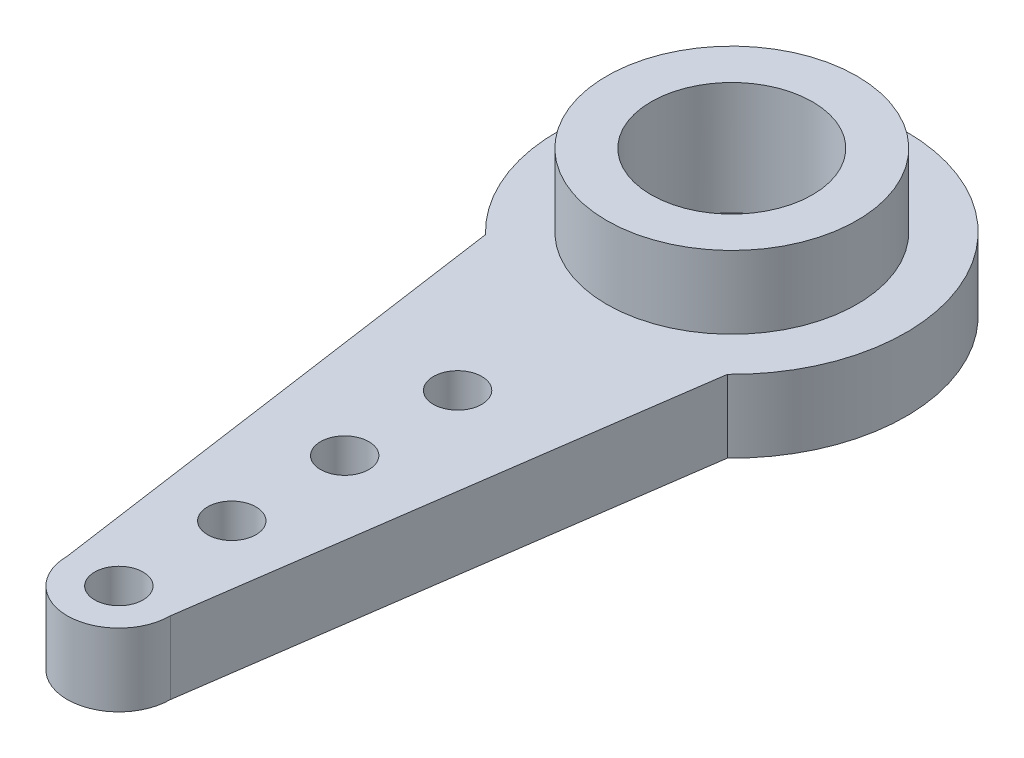
ISO-10303-21;
HEADER;
FILE_DESCRIPTION(('STEP AP214'),'2;1');
FILE_NAME('part.step','',(''),(''),'','','');
FILE_SCHEMA(('AUTOMOTIVE_DESIGN { 1 0 10303 214 1 1 1 1 }'));
ENDSEC;
DATA;
#1=APPLICATION_CONTEXT('core data for automotive mechanical design processes');
#2=APPLICATION_PROTOCOL_DEFINITION('international standard','automotive_design',2000,#1);
#3=PRODUCT_CONTEXT('',#1,'mechanical');
#4=PRODUCT('Part','Part','',(#3));
#5=PRODUCT_RELATED_PRODUCT_CATEGORY('part','',(#4));
#6=PRODUCT_DEFINITION_FORMATION('','',#4);
#7=PRODUCT_DEFINITION_CONTEXT('part definition',#1,'design');
#8=PRODUCT_DEFINITION('design','',#6,#7);
#9=PRODUCT_DEFINITION_SHAPE('','',#8);
#10=(LENGTH_UNIT() NAMED_UNIT(*) SI_UNIT(.MILLI.,.METRE.));
#11=(NAMED_UNIT(*) PLANE_ANGLE_UNIT() SI_UNIT($,.RADIAN.));
#12=(NAMED_UNIT(*) SI_UNIT($,.STERADIAN.) SOLID_ANGLE_UNIT());
#13=UNCERTAINTY_MEASURE_WITH_UNIT(LENGTH_MEASURE(1.E-05),#10,'distance_accuracy_value','');
#14=(GEOMETRIC_REPRESENTATION_CONTEXT(3) GLOBAL_UNCERTAINTY_ASSIGNED_CONTEXT((#13)) GLOBAL_UNIT_ASSIGNED_CONTEXT((#10,
#11,#12)) REPRESENTATION_CONTEXT('',''));
#15=CARTESIAN_POINT('',(0.,0.,0.));
#16=DIRECTION('',(0.,0.,1.));
#17=DIRECTION('',(1.,0.,0.));
#18=AXIS2_PLACEMENT_3D('',#15,#16,#17);
#19=CARTESIAN_POINT('',(0.,0.,0.));
#20=DIRECTION('',(0.,1.,0.));
#21=DIRECTION('',(0.,0.,1.));
#22=AXIS2_PLACEMENT_3D('',#19,#20,#21);
#23=PLANE('',#22);
#24=CARTESIAN_POINT('',(0.,0.,0.));
#25=DIRECTION('',(0.,-1.,0.));
#26=DIRECTION('',(0.,0.,-1.));
#27=AXIS2_PLACEMENT_3D('',#24,#25,#26);
#28=CIRCLE('',#27,2.00852796678638);
#29=CARTESIAN_POINT('',(0.,0.,-2.00852796678638));
#30=VERTEX_POINT('',#29);
#31=EDGE_CURVE('E167',#30,#30,#28,.T.);
#32=ORIENTED_EDGE('',*,*,#31,.F.);
#33=EDGE_LOOP('',(#32));
#34=FACE_BOUND('',#33,.T.);
#35=CARTESIAN_POINT('',(0.,0.,0.));
#36=DIRECTION('',(0.,-1.,0.));
#37=DIRECTION('',(0.,0.,-1.));
#38=AXIS2_PLACEMENT_3D('',#35,#36,#37);
#39=CIRCLE('',#38,3.);
#40=CARTESIAN_POINT('',(0.,0.,-3.));
#41=VERTEX_POINT('',#40);
#42=EDGE_CURVE('E170',#41,#41,#39,.T.);
#43=ORIENTED_EDGE('',*,*,#42,.T.);
#44=EDGE_LOOP('',(#43));
#45=FACE_BOUND('',#44,.T.);
#46=ADVANCED_FACE('F51',(#34,#45),#23,.F.);
#47=CARTESIAN_POINT('',(0.,2.25,0.));
#48=DIRECTION('',(0.,-1.,0.));
#49=DIRECTION('',(0.,0.,-1.));
#50=AXIS2_PLACEMENT_3D('',#47,#48,#49);
#51=CYLINDRICAL_SURFACE('',#50,2.5);
#52=CARTESIAN_POINT('',(0.,4.5,0.));
#53=DIRECTION('',(0.,1.,0.));
#54=DIRECTION('',(0.,0.,1.));
#55=AXIS2_PLACEMENT_3D('',#52,#53,#54);
#56=CIRCLE('',#55,2.5);
#57=CARTESIAN_POINT('',(0.,4.5,2.5));
#58=VERTEX_POINT('',#57);
#59=EDGE_CURVE('E182',#58,#58,#56,.T.);
#60=ORIENTED_EDGE('',*,*,#59,.T.);
#61=EDGE_LOOP('',(#60));
#62=FACE_BOUND('',#61,.T.);
#63=CARTESIAN_POINT('',(0.,1.,0.));
#64=DIRECTION('',(0.,-1.,0.));
#65=DIRECTION('',(0.,0.,-1.));
#66=AXIS2_PLACEMENT_3D('',#63,#64,#65);
#67=CIRCLE('',#66,2.5);
#68=CARTESIAN_POINT('',(0.,1.,-2.5));
#69=VERTEX_POINT('',#68);
#70=EDGE_CURVE('E177',#69,#69,#67,.T.);
#71=ORIENTED_EDGE('',*,*,#70,.T.);
#72=EDGE_LOOP('',(#71));
#73=FACE_BOUND('',#72,.T.);
#74=ADVANCED_FACE('F143',(#62,#73),#51,.F.);
#75=CARTESIAN_POINT('',(0.,2.25,0.));
#76=DIRECTION('',(0.,1.,0.));
#77=DIRECTION('',(0.,0.,1.));
#78=AXIS2_PLACEMENT_3D('',#75,#76,#77);
#79=PLANE('',#78);
#80=DIRECTION('',(0.140830303687937,0.,-0.990033749709152));
#81=VECTOR('',#80,1.);
#82=CARTESIAN_POINT('',(1.6,2.25,19.));
#83=LINE('',#82,#81);
#84=CARTESIAN_POINT('',(1.6,2.25,19.));
#85=VERTEX_POINT('',#84);
#86=CARTESIAN_POINT('',(3.75,2.25,3.88555015409659));
#87=VERTEX_POINT('',#86);
#88=EDGE_CURVE('E111',#85,#87,#83,.T.);
#89=ORIENTED_EDGE('',*,*,#88,.T.);
#90=CARTESIAN_POINT('',(0.,2.25,0.));
#91=DIRECTION('',(0.,1.,0.));
#92=DIRECTION('',(0.,0.,1.));
#93=AXIS2_PLACEMENT_3D('',#90,#91,#92);
#94=CIRCLE('',#93,5.4);
#95=CARTESIAN_POINT('',(-3.75,2.25,3.88555015409659));
#96=VERTEX_POINT('',#95);
#97=EDGE_CURVE('E68',#87,#96,#94,.T.);
#98=ORIENTED_EDGE('',*,*,#97,.T.);
#99=DIRECTION('',(0.140830303687938,0.,0.990033749709152));
#100=VECTOR('',#99,1.);
#101=CARTESIAN_POINT('',(-3.75,2.25,3.88555015409659));
#102=LINE('',#101,#100);
#103=CARTESIAN_POINT('',(-1.6,2.25,19.));
#104=VERTEX_POINT('',#103);
#105=EDGE_CURVE('E99',#96,#104,#102,.T.);
#106=ORIENTED_EDGE('',*,*,#105,.T.);
#107=CARTESIAN_POINT('',(0.,2.25,19.));
#108=DIRECTION('',(0.,1.,0.));
#109=DIRECTION('',(0.,0.,1.));
#110=AXIS2_PLACEMENT_3D('',#107,#108,#109);
#111=CIRCLE('',#110,1.6);
#112=EDGE_CURVE('E104',#104,#85,#111,.T.);
#113=ORIENTED_EDGE('',*,*,#112,.T.);
#114=EDGE_LOOP('',(#89,#98,#106,#113));
#115=FACE_BOUND('',#114,.T.);
#116=CARTESIAN_POINT('',(0.,2.25,8.5));
#117=DIRECTION('',(0.,1.,0.));
#118=DIRECTION('',(0.,0.,1.));
#119=AXIS2_PLACEMENT_3D('',#116,#117,#118);
#120=CIRCLE('',#119,0.75);
#121=CARTESIAN_POINT('',(0.,2.25,9.25));
#122=VERTEX_POINT('',#121);
#123=EDGE_CURVE('E192',#122,#122,#120,.T.);
#124=ORIENTED_EDGE('',*,*,#123,.F.);
#125=EDGE_LOOP('',(#124));
#126=FACE_BOUND('',#125,.T.);
#127=CARTESIAN_POINT('',(0.,2.25,15.5));
#128=DIRECTION('',(0.,1.,0.));
#129=DIRECTION('',(0.,0.,1.));
#130=AXIS2_PLACEMENT_3D('',#127,#128,#129);
#131=CIRCLE('',#130,0.750000000000001);
#132=CARTESIAN_POINT('',(0.,2.25,16.25));
#133=VERTEX_POINT('',#132);
#134=EDGE_CURVE('E204',#133,#133,#131,.T.);
#135=ORIENTED_EDGE('',*,*,#134,.F.);
#136=EDGE_LOOP('',(#135));
#137=FACE_BOUND('',#136,.T.);
#138=CARTESIAN_POINT('',(0.,2.25,19.));
#139=DIRECTION('',(0.,1.,0.));
#140=DIRECTION('',(0.,0.,1.));
#141=AXIS2_PLACEMENT_3D('',#138,#139,#140);
#142=CIRCLE('',#141,0.75);
#143=CARTESIAN_POINT('',(0.,2.25,19.75));
#144=VERTEX_POINT('',#143);
#145=EDGE_CURVE('E118',#144,#144,#142,.T.);
#146=ORIENTED_EDGE('',*,*,#145,.F.);
#147=EDGE_LOOP('',(#146));
#148=FACE_BOUND('',#147,.T.);
#149=CARTESIAN_POINT('',(0.,2.25,12.));
#150=DIRECTION('',(0.,1.,0.));
#151=DIRECTION('',(0.,0.,1.));
#152=AXIS2_PLACEMENT_3D('',#149,#150,#151);
#153=CIRCLE('',#152,0.750000000000001);
#154=CARTESIAN_POINT('',(0.,2.25,12.75));
#155=VERTEX_POINT('',#154);
#156=EDGE_CURVE('E198',#155,#155,#153,.T.);
#157=ORIENTED_EDGE('',*,*,#156,.F.);
#158=EDGE_LOOP('',(#157));
#159=FACE_BOUND('',#158,.T.);
#160=CARTESIAN_POINT('',(0.,2.25,0.));
#161=DIRECTION('',(0.,1.,0.));
#162=DIRECTION('',(0.,0.,1.));
#163=AXIS2_PLACEMENT_3D('',#160,#161,#162);
#164=CIRCLE('',#163,3.87950189537483);
#165=CARTESIAN_POINT('',(0.,2.25,3.87950189537483));
#166=VERTEX_POINT('',#165);
#167=EDGE_CURVE('E185',#166,#166,#164,.T.);
#168=ORIENTED_EDGE('',*,*,#167,.F.);
#169=EDGE_LOOP('',(#168));
#170=FACE_BOUND('',#169,.T.);
#171=ADVANCED_FACE('F101',(#115,#126,#137,#148,#159,#170),#79,.T.);
#172=CARTESIAN_POINT('',(0.,0.,0.));
#173=DIRECTION('',(0.,-1.,0.));
#174=DIRECTION('',(0.,0.,-1.));
#175=AXIS2_PLACEMENT_3D('',#172,#173,#174);
#176=CIRCLE('',#175,3.8);
#177=CARTESIAN_POINT('',(0.,0.,-3.8));
#178=VERTEX_POINT('',#177);
#179=EDGE_CURVE('E161',#178,#178,#176,.T.);
#180=ORIENTED_EDGE('',*,*,#179,.F.);
#181=EDGE_LOOP('',(#180));
#182=FACE_BOUND('',#181,.T.);
#183=DIRECTION('',(0.140830303687938,0.,0.990033749709152));
#184=VECTOR('',#183,1.);
#185=CARTESIAN_POINT('',(-3.75,0.,3.88555015409659));
#186=LINE('',#185,#184);
#187=CARTESIAN_POINT('',(-3.75,0.,3.88555015409659));
#188=VERTEX_POINT('',#187);
#189=CARTESIAN_POINT('',(-1.6,0.,19.));
#190=VERTEX_POINT('',#189);
#191=EDGE_CURVE('E107',#188,#190,#186,.T.);
#192=ORIENTED_EDGE('',*,*,#191,.F.);
#193=CARTESIAN_POINT('',(0.,0.,0.));
#194=DIRECTION('',(0.,1.,0.));
#195=DIRECTION('',(0.,0.,1.));
#196=AXIS2_PLACEMENT_3D('',#193,#194,#195);
#197=CIRCLE('',#196,5.4);
#198=CARTESIAN_POINT('',(3.75,0.,3.88555015409659));
#199=VERTEX_POINT('',#198);
#200=EDGE_CURVE('E121',#199,#188,#197,.T.);
#201=ORIENTED_EDGE('',*,*,#200,.F.);
#202=DIRECTION('',(0.140830303687937,0.,-0.990033749709152));
#203=VECTOR('',#202,1.);
#204=CARTESIAN_POINT('',(1.6,0.,19.));
#205=LINE('',#204,#203);
#206=CARTESIAN_POINT('',(1.6,0.,19.));
#207=VERTEX_POINT('',#206);
#208=EDGE_CURVE('E93',#207,#199,#205,.T.);
#209=ORIENTED_EDGE('',*,*,#208,.F.);
#210=CARTESIAN_POINT('',(0.,0.,19.));
#211=DIRECTION('',(0.,1.,0.));
#212=DIRECTION('',(0.,0.,1.));
#213=AXIS2_PLACEMENT_3D('',#210,#211,#212);
#214=CIRCLE('',#213,1.6);
#215=EDGE_CURVE('E86',#190,#207,#214,.T.);
#216=ORIENTED_EDGE('',*,*,#215,.F.);
#217=EDGE_LOOP('',(#192,#201,#209,#216));
#218=FACE_BOUND('',#217,.T.);
#219=CARTESIAN_POINT('',(0.,0.,19.));
#220=DIRECTION('',(0.,1.,0.));
#221=DIRECTION('',(0.,0.,1.));
#222=AXIS2_PLACEMENT_3D('',#219,#220,#221);
#223=CIRCLE('',#222,0.75);
#224=CARTESIAN_POINT('',(0.,0.,19.75));
#225=VERTEX_POINT('',#224);
#226=EDGE_CURVE('E207',#225,#225,#223,.T.);
#227=ORIENTED_EDGE('',*,*,#226,.T.);
#228=EDGE_LOOP('',(#227));
#229=FACE_BOUND('',#228,.T.);
#230=CARTESIAN_POINT('',(0.,0.,15.5));
#231=DIRECTION('',(0.,1.,0.));
#232=DIRECTION('',(0.,0.,1.));
#233=AXIS2_PLACEMENT_3D('',#230,#231,#232);
#234=CIRCLE('',#233,0.750000000000001);
#235=CARTESIAN_POINT('',(0.,0.,16.25));
#236=VERTEX_POINT('',#235);
#237=EDGE_CURVE('E201',#236,#236,#234,.T.);
#238=ORIENTED_EDGE('',*,*,#237,.T.);
#239=EDGE_LOOP('',(#238));
#240=FACE_BOUND('',#239,.T.);
#241=CARTESIAN_POINT('',(0.,0.,12.));
#242=DIRECTION('',(0.,1.,0.));
#243=DIRECTION('',(0.,0.,1.));
#244=AXIS2_PLACEMENT_3D('',#241,#242,#243);
#245=CIRCLE('',#244,0.750000000000001);
#246=CARTESIAN_POINT('',(0.,0.,12.75));
#247=VERTEX_POINT('',#246);
#248=EDGE_CURVE('E195',#247,#247,#245,.T.);
#249=ORIENTED_EDGE('',*,*,#248,.T.);
#250=EDGE_LOOP('',(#249));
#251=FACE_BOUND('',#250,.T.);
#252=CARTESIAN_POINT('',(0.,0.,8.5));
#253=DIRECTION('',(0.,1.,0.));
#254=DIRECTION('',(0.,0.,1.));
#255=AXIS2_PLACEMENT_3D('',#252,#253,#254);
#256=CIRCLE('',#255,0.75);
#257=CARTESIAN_POINT('',(0.,0.,9.25));
#258=VERTEX_POINT('',#257);
#259=EDGE_CURVE('E189',#258,#258,#256,.T.);
#260=ORIENTED_EDGE('',*,*,#259,.T.);
#261=EDGE_LOOP('',(#260));
#262=FACE_BOUND('',#261,.T.);
#263=ADVANCED_FACE('F127',(#182,#218,#229,#240,#251,#262),#23,.F.);
#264=CARTESIAN_POINT('',(-3.75,2.25,3.88555015409659));
#265=DIRECTION('',(0.990033749709152,0.,-0.140830303687938));
#266=DIRECTION('',(-0.140830303687938,0.,-0.990033749709152));
#267=AXIS2_PLACEMENT_3D('',#264,#265,#266);
#268=PLANE('',#267);
#269=ORIENTED_EDGE('',*,*,#191,.T.);
#270=DIRECTION('',(0.,-1.,0.));
#271=VECTOR('',#270,1.);
#272=CARTESIAN_POINT('',(-1.6,2.25,19.));
#273=LINE('',#272,#271);
#274=EDGE_CURVE('E60',#104,#190,#273,.T.);
#275=ORIENTED_EDGE('',*,*,#274,.F.);
#276=ORIENTED_EDGE('',*,*,#105,.F.);
#277=DIRECTION('',(0.,-1.,0.));
#278=VECTOR('',#277,1.);
#279=CARTESIAN_POINT('',(-3.75,2.25,3.88555015409659));
#280=LINE('',#279,#278);
#281=EDGE_CURVE('E13',#96,#188,#280,.T.);
#282=ORIENTED_EDGE('',*,*,#281,.T.);
#283=EDGE_LOOP('',(#269,#275,#276,#282));
#284=FACE_BOUND('',#283,.T.);
#285=ADVANCED_FACE('F53',(#284),#268,.F.);
#286=CARTESIAN_POINT('',(0.,2.25,19.));
#287=DIRECTION('',(0.,-1.,0.));
#288=DIRECTION('',(0.,0.,-1.));
#289=AXIS2_PLACEMENT_3D('',#286,#287,#288);
#290=CYLINDRICAL_SURFACE('',#289,1.6);
#291=ORIENTED_EDGE('',*,*,#215,.T.);
#292=DIRECTION('',(0.,-1.,0.));
#293=VECTOR('',#292,1.);
#294=CARTESIAN_POINT('',(1.6,2.25,19.));
#295=LINE('',#294,#293);
#296=EDGE_CURVE('E108',#85,#207,#295,.T.);
#297=ORIENTED_EDGE('',*,*,#296,.F.);
#298=ORIENTED_EDGE('',*,*,#112,.F.);
#299=ORIENTED_EDGE('',*,*,#274,.T.);
#300=EDGE_LOOP('',(#291,#297,#298,#299));
#301=FACE_BOUND('',#300,.T.);
#302=ADVANCED_FACE('F109',(#301),#290,.T.);
#303=CARTESIAN_POINT('',(1.6,2.25,19.));
#304=DIRECTION('',(-0.990033749709152,0.,-0.140830303687937));
#305=DIRECTION('',(-0.140830303687937,0.,0.990033749709152));
#306=AXIS2_PLACEMENT_3D('',#303,#304,#305);
#307=PLANE('',#306);
#308=ORIENTED_EDGE('',*,*,#208,.T.);
#309=DIRECTION('',(0.,-1.,0.));
#310=VECTOR('',#309,1.);
#311=CARTESIAN_POINT('',(3.75,2.25,3.88555015409659));
#312=LINE('',#311,#310);
#313=EDGE_CURVE('E113',#87,#199,#312,.T.);
#314=ORIENTED_EDGE('',*,*,#313,.F.);
#315=ORIENTED_EDGE('',*,*,#88,.F.);
#316=ORIENTED_EDGE('',*,*,#296,.T.);
#317=EDGE_LOOP('',(#308,#314,#315,#316));
#318=FACE_BOUND('',#317,.T.);
#319=ADVANCED_FACE('F124',(#318),#307,.F.);
#320=CARTESIAN_POINT('',(0.,2.25,0.));
#321=DIRECTION('',(0.,-1.,0.));
#322=DIRECTION('',(0.,0.,-1.));
#323=AXIS2_PLACEMENT_3D('',#320,#321,#322);
#324=CYLINDRICAL_SURFACE('',#323,5.4);
#325=ORIENTED_EDGE('',*,*,#200,.T.);
#326=ORIENTED_EDGE('',*,*,#281,.F.);
#327=ORIENTED_EDGE('',*,*,#97,.F.);
#328=ORIENTED_EDGE('',*,*,#313,.T.);
#329=EDGE_LOOP('',(#325,#326,#327,#328));
#330=FACE_BOUND('',#329,.T.);
#331=ADVANCED_FACE('F129',(#330),#324,.T.);
#332=CARTESIAN_POINT('',(0.,2.25,19.));
#333=DIRECTION('',(0.,-1.,0.));
#334=DIRECTION('',(0.,0.,-1.));
#335=AXIS2_PLACEMENT_3D('',#332,#333,#334);
#336=CYLINDRICAL_SURFACE('',#335,0.75);
#337=ORIENTED_EDGE('',*,*,#145,.T.);
#338=EDGE_LOOP('',(#337));
#339=FACE_BOUND('',#338,.T.);
#340=ORIENTED_EDGE('',*,*,#226,.F.);
#341=EDGE_LOOP('',(#340));
#342=FACE_BOUND('',#341,.T.);
#343=ADVANCED_FACE('F131',(#339,#342),#336,.F.);
#344=CARTESIAN_POINT('',(0.,2.25,15.5));
#345=DIRECTION('',(0.,-1.,0.));
#346=DIRECTION('',(0.,0.,-1.));
#347=AXIS2_PLACEMENT_3D('',#344,#345,#346);
#348=CYLINDRICAL_SURFACE('',#347,0.750000000000001);
#349=ORIENTED_EDGE('',*,*,#134,.T.);
#350=EDGE_LOOP('',(#349));
#351=FACE_BOUND('',#350,.T.);
#352=ORIENTED_EDGE('',*,*,#237,.F.);
#353=EDGE_LOOP('',(#352));
#354=FACE_BOUND('',#353,.T.);
#355=ADVANCED_FACE('F137',(#351,#354),#348,.F.);
#356=CARTESIAN_POINT('',(0.,2.25,12.));
#357=DIRECTION('',(0.,-1.,0.));
#358=DIRECTION('',(0.,0.,-1.));
#359=AXIS2_PLACEMENT_3D('',#356,#357,#358);
#360=CYLINDRICAL_SURFACE('',#359,0.750000000000001);
#361=ORIENTED_EDGE('',*,*,#156,.T.);
#362=EDGE_LOOP('',(#361));
#363=FACE_BOUND('',#362,.T.);
#364=ORIENTED_EDGE('',*,*,#248,.F.);
#365=EDGE_LOOP('',(#364));
#366=FACE_BOUND('',#365,.T.);
#367=ADVANCED_FACE('F225',(#363,#366),#360,.F.);
#368=CARTESIAN_POINT('',(0.,2.25,8.5));
#369=DIRECTION('',(0.,-1.,0.));
#370=DIRECTION('',(0.,0.,-1.));
#371=AXIS2_PLACEMENT_3D('',#368,#369,#370);
#372=CYLINDRICAL_SURFACE('',#371,0.75);
#373=ORIENTED_EDGE('',*,*,#123,.T.);
#374=EDGE_LOOP('',(#373));
#375=FACE_BOUND('',#374,.T.);
#376=ORIENTED_EDGE('',*,*,#259,.F.);
#377=EDGE_LOOP('',(#376));
#378=FACE_BOUND('',#377,.T.);
#379=ADVANCED_FACE('F222',(#375,#378),#372,.F.);
#380=CARTESIAN_POINT('',(0.,4.5,0.));
#381=DIRECTION('',(0.,1.,0.));
#382=DIRECTION('',(0.,0.,1.));
#383=AXIS2_PLACEMENT_3D('',#380,#381,#382);
#384=PLANE('',#383);
#385=CARTESIAN_POINT('',(0.,4.5,0.));
#386=DIRECTION('',(0.,1.,0.));
#387=DIRECTION('',(0.,0.,1.));
#388=AXIS2_PLACEMENT_3D('',#385,#386,#387);
#389=CIRCLE('',#388,3.87950189537483);
#390=CARTESIAN_POINT('',(0.,4.5,3.87950189537483));
#391=VERTEX_POINT('',#390);
#392=EDGE_CURVE('E186',#391,#391,#389,.T.);
#393=ORIENTED_EDGE('',*,*,#392,.T.);
#394=EDGE_LOOP('',(#393));
#395=FACE_BOUND('',#394,.T.);
#396=ORIENTED_EDGE('',*,*,#59,.F.);
#397=EDGE_LOOP('',(#396));
#398=FACE_BOUND('',#397,.T.);
#399=ADVANCED_FACE('F224',(#395,#398),#384,.T.);
#400=CARTESIAN_POINT('',(0.,4.5,0.));
#401=DIRECTION('',(0.,-1.,0.));
#402=DIRECTION('',(0.,0.,-1.));
#403=AXIS2_PLACEMENT_3D('',#400,#401,#402);
#404=CYLINDRICAL_SURFACE('',#403,3.87950189537483);
#405=ORIENTED_EDGE('',*,*,#392,.F.);
#406=EDGE_LOOP('',(#405));
#407=FACE_BOUND('',#406,.T.);
#408=ORIENTED_EDGE('',*,*,#167,.T.);
#409=EDGE_LOOP('',(#408));
#410=FACE_BOUND('',#409,.T.);
#411=ADVANCED_FACE('F232',(#407,#410),#404,.T.);
#412=CARTESIAN_POINT('',(0.,1.,0.));
#413=DIRECTION('',(0.,-1.,0.));
#414=DIRECTION('',(0.,0.,-1.));
#415=AXIS2_PLACEMENT_3D('',#412,#413,#414);
#416=PLANE('',#415);
#417=CARTESIAN_POINT('',(0.,1.,0.));
#418=DIRECTION('',(0.,-1.,0.));
#419=DIRECTION('',(0.,0.,-1.));
#420=AXIS2_PLACEMENT_3D('',#417,#418,#419);
#421=CIRCLE('',#420,2.00852796678638);
#422=CARTESIAN_POINT('',(0.,1.,-2.00852796678638));
#423=VERTEX_POINT('',#422);
#424=EDGE_CURVE('E174',#423,#423,#421,.T.);
#425=ORIENTED_EDGE('',*,*,#424,.T.);
#426=EDGE_LOOP('',(#425));
#427=FACE_BOUND('',#426,.T.);
#428=ORIENTED_EDGE('',*,*,#70,.F.);
#429=EDGE_LOOP('',(#428));
#430=FACE_BOUND('',#429,.T.);
#431=ADVANCED_FACE('F254',(#427,#430),#416,.F.);
#432=CARTESIAN_POINT('',(0.,1.,0.));
#433=DIRECTION('',(0.,-1.,0.));
#434=DIRECTION('',(0.,0.,-1.));
#435=AXIS2_PLACEMENT_3D('',#432,#433,#434);
#436=CYLINDRICAL_SURFACE('',#435,2.00852796678638);
#437=ORIENTED_EDGE('',*,*,#424,.F.);
#438=EDGE_LOOP('',(#437));
#439=FACE_BOUND('',#438,.T.);
#440=ORIENTED_EDGE('',*,*,#31,.T.);
#441=EDGE_LOOP('',(#440));
#442=FACE_BOUND('',#441,.T.);
#443=ADVANCED_FACE('F259',(#439,#442),#436,.F.);
#444=CARTESIAN_POINT('',(0.,0.5,0.));
#445=DIRECTION('',(0.,-1.,0.));
#446=DIRECTION('',(0.,0.,-1.));
#447=AXIS2_PLACEMENT_3D('',#444,#445,#446);
#448=CYLINDRICAL_SURFACE('',#447,3.8);
#449=CARTESIAN_POINT('',(0.,0.5,0.));
#450=DIRECTION('',(0.,-1.,0.));
#451=DIRECTION('',(0.,0.,-1.));
#452=AXIS2_PLACEMENT_3D('',#449,#450,#451);
#453=CIRCLE('',#452,3.8);
#454=CARTESIAN_POINT('',(0.,0.5,-3.8));
#455=VERTEX_POINT('',#454);
#456=EDGE_CURVE('E163',#455,#455,#453,.T.);
#457=ORIENTED_EDGE('',*,*,#456,.F.);
#458=EDGE_LOOP('',(#457));
#459=FACE_BOUND('',#458,.T.);
#460=ORIENTED_EDGE('',*,*,#179,.T.);
#461=EDGE_LOOP('',(#460));
#462=FACE_BOUND('',#461,.T.);
#463=ADVANCED_FACE('F271',(#459,#462),#448,.F.);
#464=CARTESIAN_POINT('',(0.,0.5,0.));
#465=DIRECTION('',(0.,-1.,0.));
#466=DIRECTION('',(0.,0.,-1.));
#467=AXIS2_PLACEMENT_3D('',#464,#465,#466);
#468=PLANE('',#467);
#469=CARTESIAN_POINT('',(0.,0.5,0.));
#470=DIRECTION('',(0.,-1.,0.));
#471=DIRECTION('',(0.,0.,-1.));
#472=AXIS2_PLACEMENT_3D('',#469,#470,#471);
#473=CIRCLE('',#472,3.);
#474=CARTESIAN_POINT('',(0.,0.5,-3.));
#475=VERTEX_POINT('',#474);
#476=EDGE_CURVE('E164',#475,#475,#473,.T.);
#477=ORIENTED_EDGE('',*,*,#476,.F.);
#478=EDGE_LOOP('',(#477));
#479=FACE_BOUND('',#478,.T.);
#480=ORIENTED_EDGE('',*,*,#456,.T.);
#481=EDGE_LOOP('',(#480));
#482=FACE_BOUND('',#481,.T.);
#483=ADVANCED_FACE('F277',(#479,#482),#468,.T.);
#484=CARTESIAN_POINT('',(0.,0.5,0.));
#485=DIRECTION('',(0.,-1.,0.));
#486=DIRECTION('',(0.,0.,-1.));
#487=AXIS2_PLACEMENT_3D('',#484,#485,#486);
#488=CYLINDRICAL_SURFACE('',#487,3.);
#489=ORIENTED_EDGE('',*,*,#476,.T.);
#490=EDGE_LOOP('',(#489));
#491=FACE_BOUND('',#490,.T.);
#492=ORIENTED_EDGE('',*,*,#42,.F.);
#493=EDGE_LOOP('',(#492));
#494=FACE_BOUND('',#493,.T.);
#495=ADVANCED_FACE('F281',(#491,#494),#488,.T.);
#496=CLOSED_SHELL('',(#46,#74,#171,#263,#285,#302,#319,#331,#343,#355,#367,#379,#399,#411,#431,
#443,#463,#483,#495));
#497=MANIFOLD_SOLID_BREP('B2',#496);
#498=ADVANCED_BREP_SHAPE_REPRESENTATION('',(#18,#497),#14);
#499=SHAPE_DEFINITION_REPRESENTATION(#9,#498);
ENDSEC;
END-ISO-10303-21;
